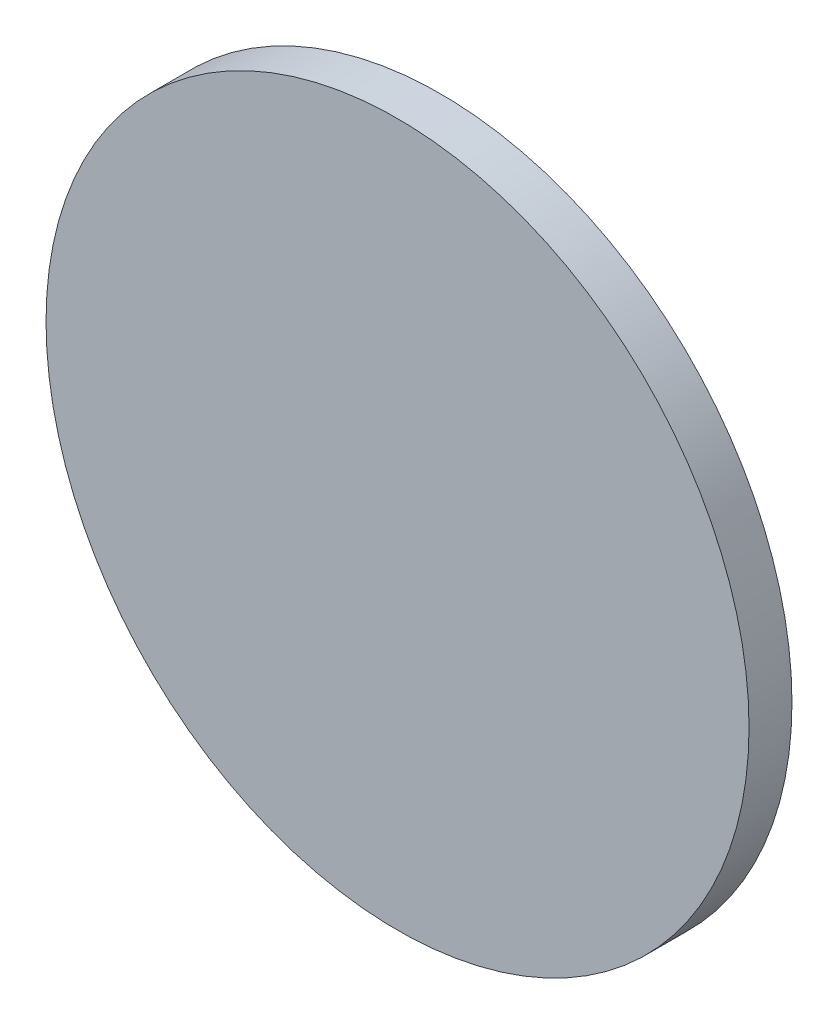
ISO-10303-21;
HEADER;
FILE_DESCRIPTION(('STEP AP214'),'2;1');
FILE_NAME('part.step','',(''),(''),'','','');
FILE_SCHEMA(('AUTOMOTIVE_DESIGN { 1 0 10303 214 1 1 1 1 }'));
ENDSEC;
DATA;
#1=APPLICATION_CONTEXT('core data for automotive mechanical design processes');
#2=APPLICATION_PROTOCOL_DEFINITION('international standard','automotive_design',2000,#1);
#3=PRODUCT_CONTEXT('',#1,'mechanical');
#4=PRODUCT('Part','Part','',(#3));
#5=PRODUCT_RELATED_PRODUCT_CATEGORY('part','',(#4));
#6=PRODUCT_DEFINITION_FORMATION('','',#4);
#7=PRODUCT_DEFINITION_CONTEXT('part definition',#1,'design');
#8=PRODUCT_DEFINITION('design','',#6,#7);
#9=PRODUCT_DEFINITION_SHAPE('','',#8);
#10=(LENGTH_UNIT() NAMED_UNIT(*) SI_UNIT(.MILLI.,.METRE.));
#11=(NAMED_UNIT(*) PLANE_ANGLE_UNIT() SI_UNIT($,.RADIAN.));
#12=(NAMED_UNIT(*) SI_UNIT($,.STERADIAN.) SOLID_ANGLE_UNIT());
#13=UNCERTAINTY_MEASURE_WITH_UNIT(LENGTH_MEASURE(1.E-05),#10,'distance_accuracy_value','');
#14=(GEOMETRIC_REPRESENTATION_CONTEXT(3) GLOBAL_UNCERTAINTY_ASSIGNED_CONTEXT((#13)) GLOBAL_UNIT_ASSIGNED_CONTEXT((#10,
#11,#12)) REPRESENTATION_CONTEXT('',''));
#15=CARTESIAN_POINT('',(0.,0.,0.));
#16=DIRECTION('',(0.,0.,1.));
#17=DIRECTION('',(1.,0.,0.));
#18=AXIS2_PLACEMENT_3D('',#15,#16,#17);
#19=CARTESIAN_POINT('',(0.,0.,3.175));
#20=DIRECTION('',(0.,0.,-1.));
#21=DIRECTION('',(-1.,0.,0.));
#22=AXIS2_PLACEMENT_3D('',#19,#20,#21);
#23=CYLINDRICAL_SURFACE('',#22,26.);
#24=CARTESIAN_POINT('',(0.,0.,3.175));
#25=DIRECTION('',(0.,0.,1.));
#26=DIRECTION('',(1.,0.,0.));
#27=AXIS2_PLACEMENT_3D('',#24,#25,#26);
#28=CIRCLE('',#27,26.);
#29=CARTESIAN_POINT('',(26.,0.,3.175));
#30=VERTEX_POINT('',#29);
#31=EDGE_CURVE('E10',#30,#30,#28,.T.);
#32=ORIENTED_EDGE('',*,*,#31,.F.);
#33=EDGE_LOOP('',(#32));
#34=FACE_BOUND('',#33,.T.);
#35=CARTESIAN_POINT('',(0.,0.,0.));
#36=DIRECTION('',(0.,0.,1.));
#37=DIRECTION('',(1.,0.,0.));
#38=AXIS2_PLACEMENT_3D('',#35,#36,#37);
#39=CIRCLE('',#38,26.);
#40=CARTESIAN_POINT('',(26.,0.,0.));
#41=VERTEX_POINT('',#40);
#42=EDGE_CURVE('E42',#41,#41,#39,.T.);
#43=ORIENTED_EDGE('',*,*,#42,.T.);
#44=EDGE_LOOP('',(#43));
#45=FACE_BOUND('',#44,.T.);
#46=ADVANCED_FACE('F39',(#34,#45),#23,.T.);
#47=CARTESIAN_POINT('',(0.,0.,3.175));
#48=DIRECTION('',(0.,0.,1.));
#49=DIRECTION('',(1.,0.,0.));
#50=AXIS2_PLACEMENT_3D('',#47,#48,#49);
#51=PLANE('',#50);
#52=ORIENTED_EDGE('',*,*,#31,.T.);
#53=EDGE_LOOP('',(#52));
#54=FACE_BOUND('',#53,.T.);
#55=ADVANCED_FACE('F54',(#54),#51,.T.);
#56=CARTESIAN_POINT('',(0.,0.,0.));
#57=DIRECTION('',(0.,0.,1.));
#58=DIRECTION('',(1.,0.,0.));
#59=AXIS2_PLACEMENT_3D('',#56,#57,#58);
#60=PLANE('',#59);
#61=ORIENTED_EDGE('',*,*,#42,.F.);
#62=EDGE_LOOP('',(#61));
#63=FACE_BOUND('',#62,.T.);
#64=ADVANCED_FACE('F52',(#63),#60,.F.);
#65=CLOSED_SHELL('',(#46,#55,#64));
#66=MANIFOLD_SOLID_BREP('B2',#65);
#67=ADVANCED_BREP_SHAPE_REPRESENTATION('',(#18,#66),#14);
#68=SHAPE_DEFINITION_REPRESENTATION(#9,#67);
ENDSEC;
END-ISO-10303-21;
